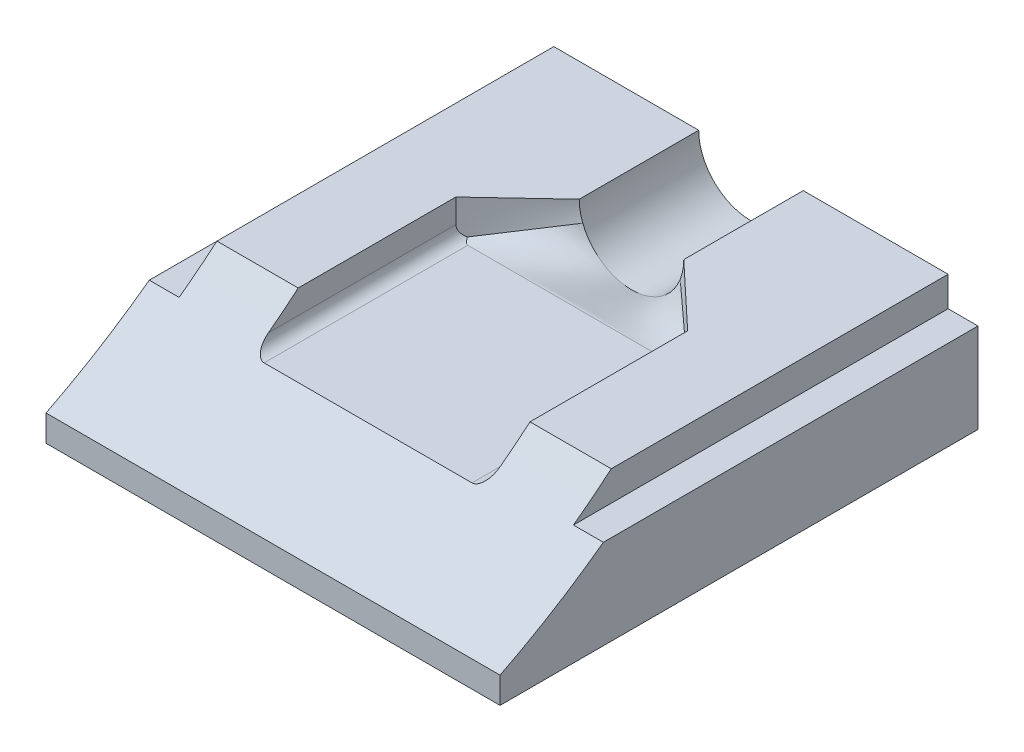
ISO-10303-21;
HEADER;
FILE_DESCRIPTION(('STEP AP214'),'2;1');
FILE_NAME('part.step','',(''),(''),'','','');
FILE_SCHEMA(('AUTOMOTIVE_DESIGN { 1 0 10303 214 1 1 1 1 }'));
ENDSEC;
DATA;
#1=APPLICATION_CONTEXT('core data for automotive mechanical design processes');
#2=APPLICATION_PROTOCOL_DEFINITION('international standard','automotive_design',2000,#1);
#3=PRODUCT_CONTEXT('',#1,'mechanical');
#4=PRODUCT('Part','Part','',(#3));
#5=PRODUCT_RELATED_PRODUCT_CATEGORY('part','',(#4));
#6=PRODUCT_DEFINITION_FORMATION('','',#4);
#7=PRODUCT_DEFINITION_CONTEXT('part definition',#1,'design');
#8=PRODUCT_DEFINITION('design','',#6,#7);
#9=PRODUCT_DEFINITION_SHAPE('','',#8);
#10=(LENGTH_UNIT() NAMED_UNIT(*) SI_UNIT(.MILLI.,.METRE.));
#11=(NAMED_UNIT(*) PLANE_ANGLE_UNIT() SI_UNIT($,.RADIAN.));
#12=(NAMED_UNIT(*) SI_UNIT($,.STERADIAN.) SOLID_ANGLE_UNIT());
#13=UNCERTAINTY_MEASURE_WITH_UNIT(LENGTH_MEASURE(1.E-05),#10,'distance_accuracy_value','');
#14=(GEOMETRIC_REPRESENTATION_CONTEXT(3) GLOBAL_UNCERTAINTY_ASSIGNED_CONTEXT((#13)) GLOBAL_UNIT_ASSIGNED_CONTEXT((#10,
#11,#12)) REPRESENTATION_CONTEXT('',''));
#15=CARTESIAN_POINT('',(0.,0.,0.));
#16=DIRECTION('',(0.,0.,1.));
#17=DIRECTION('',(1.,0.,0.));
#18=AXIS2_PLACEMENT_3D('',#15,#16,#17);
#19=CARTESIAN_POINT('',(-24.13,6.35,50.8));
#20=DIRECTION('',(0.,-1.,0.));
#21=DIRECTION('',(0.,0.,-1.));
#22=AXIS2_PLACEMENT_3D('',#19,#20,#21);
#23=PLANE('',#22);
#24=DIRECTION('',(0.,0.,1.));
#25=VECTOR('',#24,1.);
#26=CARTESIAN_POINT('',(12.319,6.35,19.05));
#27=LINE('',#26,#25);
#28=CARTESIAN_POINT('',(12.319,6.35,19.05));
#29=VERTEX_POINT('',#28);
#30=CARTESIAN_POINT('',(12.319,6.35,35.8059844851894));
#31=VERTEX_POINT('',#30);
#32=EDGE_CURVE('E320',#29,#31,#27,.T.);
#33=ORIENTED_EDGE('',*,*,#32,.T.);
#34=DIRECTION('',(-1.,0.,0.));
#35=VECTOR('',#34,1.);
#36=CARTESIAN_POINT('',(24.13,6.35,35.8059844851894));
#37=LINE('',#36,#35);
#38=CARTESIAN_POINT('',(20.955,6.35,35.8059844851894));
#39=VERTEX_POINT('',#38);
#40=EDGE_CURVE('E376',#31,#39,#37,.F.);
#41=ORIENTED_EDGE('',*,*,#40,.T.);
#42=DIRECTION('',(0.,0.,-1.));
#43=VECTOR('',#42,1.);
#44=CARTESIAN_POINT('',(20.955,6.35,50.8));
#45=LINE('',#44,#43);
#46=CARTESIAN_POINT('',(20.955,6.35,0.));
#47=VERTEX_POINT('',#46);
#48=EDGE_CURVE('E232',#39,#47,#45,.T.);
#49=ORIENTED_EDGE('',*,*,#48,.T.);
#50=DIRECTION('',(-1.,0.,0.));
#51=VECTOR('',#50,1.);
#52=CARTESIAN_POINT('',(-24.13,6.35,0.));
#53=LINE('',#52,#51);
#54=CARTESIAN_POINT('',(5.55625,6.35,0.));
#55=VERTEX_POINT('',#54);
#56=EDGE_CURVE('E251',#47,#55,#53,.T.);
#57=ORIENTED_EDGE('',*,*,#56,.T.);
#58=DIRECTION('',(0.,0.,-1.));
#59=VECTOR('',#58,1.);
#60=CARTESIAN_POINT('',(5.55625,6.35,12.7));
#61=LINE('',#60,#59);
#62=CARTESIAN_POINT('',(5.55625,6.35,12.7));
#63=VERTEX_POINT('',#62);
#64=EDGE_CURVE('E589',#63,#55,#61,.T.);
#65=ORIENTED_EDGE('',*,*,#64,.F.);
#66=CARTESIAN_POINT('',(12.319,6.35,19.05));
#67=CARTESIAN_POINT('',(10.06475,6.35,16.9333333333333));
#68=CARTESIAN_POINT('',(7.8105,6.35,14.8166666666667));
#69=CARTESIAN_POINT('',(5.55625,6.35,12.7));
#70=B_SPLINE_CURVE_WITH_KNOTS('',3,(#66,#67,#68,#69),.UNSPECIFIED.,.F.,.F.,(4,4),(0.,1.),.UNSPECIFIED.);
#71=EDGE_CURVE('E379',#63,#29,#70,.F.);
#72=ORIENTED_EDGE('',*,*,#71,.T.);
#73=EDGE_LOOP('',(#33,#41,#49,#57,#65,#72));
#74=FACE_BOUND('',#73,.T.);
#75=ADVANCED_FACE('F65',(#74),#23,.F.);
#76=DIRECTION('',(0.,0.,-1.));
#77=VECTOR('',#76,1.);
#78=CARTESIAN_POINT('',(-20.955,6.35,50.8));
#79=LINE('',#78,#77);
#80=CARTESIAN_POINT('',(-20.955,6.35,35.8059844851894));
#81=VERTEX_POINT('',#80);
#82=CARTESIAN_POINT('',(-20.955,6.35,0.));
#83=VERTEX_POINT('',#82);
#84=EDGE_CURVE('E611',#81,#83,#79,.T.);
#85=ORIENTED_EDGE('',*,*,#84,.F.);
#86=DIRECTION('',(-1.,0.,0.));
#87=VECTOR('',#86,1.);
#88=CARTESIAN_POINT('',(24.13,6.35,35.8059844851894));
#89=LINE('',#88,#87);
#90=CARTESIAN_POINT('',(-12.319,6.35,35.8059844851894));
#91=VERTEX_POINT('',#90);
#92=EDGE_CURVE('E391',#81,#91,#89,.F.);
#93=ORIENTED_EDGE('',*,*,#92,.T.);
#94=DIRECTION('',(0.,0.,1.));
#95=VECTOR('',#94,1.);
#96=CARTESIAN_POINT('',(-12.319,6.35,19.05));
#97=LINE('',#96,#95);
#98=CARTESIAN_POINT('',(-12.319,6.35,19.05));
#99=VERTEX_POINT('',#98);
#100=EDGE_CURVE('E328',#99,#91,#97,.T.);
#101=ORIENTED_EDGE('',*,*,#100,.F.);
#102=CARTESIAN_POINT('',(-5.55625,6.35,12.7));
#103=CARTESIAN_POINT('',(-7.8105,6.35,14.8166666666667));
#104=CARTESIAN_POINT('',(-10.06475,6.35,16.9333333333333));
#105=CARTESIAN_POINT('',(-12.319,6.35,19.05));
#106=B_SPLINE_CURVE_WITH_KNOTS('',3,(#102,#103,#104,#105),.UNSPECIFIED.,.F.,.F.,(4,4),(0.,1.),.UNSPECIFIED.);
#107=CARTESIAN_POINT('',(-5.55625,6.35,12.7));
#108=VERTEX_POINT('',#107);
#109=EDGE_CURVE('E583',#108,#99,#106,.T.);
#110=ORIENTED_EDGE('',*,*,#109,.F.);
#111=DIRECTION('',(0.,0.,-1.));
#112=VECTOR('',#111,1.);
#113=CARTESIAN_POINT('',(-5.55625,6.35,12.7));
#114=LINE('',#113,#112);
#115=CARTESIAN_POINT('',(-5.55625,6.35,0.));
#116=VERTEX_POINT('',#115);
#117=EDGE_CURVE('E250',#116,#108,#114,.F.);
#118=ORIENTED_EDGE('',*,*,#117,.F.);
#119=EDGE_CURVE('E249',#116,#83,#53,.T.);
#120=ORIENTED_EDGE('',*,*,#119,.T.);
#121=EDGE_LOOP('',(#85,#93,#101,#110,#118,#120));
#122=FACE_BOUND('',#121,.T.);
#123=ADVANCED_FACE('F295',(#122),#23,.F.);
#124=CARTESIAN_POINT('',(0.,0.,0.));
#125=DIRECTION('',(0.,0.,1.));
#126=DIRECTION('',(1.,0.,0.));
#127=AXIS2_PLACEMENT_3D('',#124,#125,#126);
#128=PLANE('',#127);
#129=DIRECTION('',(-1.,0.,0.));
#130=VECTOR('',#129,1.);
#131=CARTESIAN_POINT('',(-20.955,3.175,0.));
#132=LINE('',#131,#130);
#133=CARTESIAN_POINT('',(-20.955,3.175,0.));
#134=VERTEX_POINT('',#133);
#135=CARTESIAN_POINT('',(-24.13,3.175,0.));
#136=VERTEX_POINT('',#135);
#137=EDGE_CURVE('E617',#134,#136,#132,.T.);
#138=ORIENTED_EDGE('',*,*,#137,.F.);
#139=DIRECTION('',(0.,-1.,0.));
#140=VECTOR('',#139,1.);
#141=CARTESIAN_POINT('',(-20.955,6.35,0.));
#142=LINE('',#141,#140);
#143=EDGE_CURVE('E610',#83,#134,#142,.T.);
#144=ORIENTED_EDGE('',*,*,#143,.F.);
#145=ORIENTED_EDGE('',*,*,#119,.F.);
#146=CARTESIAN_POINT('',(0.,6.35,0.));
#147=DIRECTION('',(0.,0.,1.));
#148=DIRECTION('',(1.,0.,0.));
#149=AXIS2_PLACEMENT_3D('',#146,#147,#148);
#150=CIRCLE('',#149,5.55625);
#151=EDGE_CURVE('E260',#55,#116,#150,.F.);
#152=ORIENTED_EDGE('',*,*,#151,.F.);
#153=ORIENTED_EDGE('',*,*,#56,.F.);
#154=DIRECTION('',(0.,-1.,0.));
#155=VECTOR('',#154,1.);
#156=CARTESIAN_POINT('',(20.955,6.35,0.));
#157=LINE('',#156,#155);
#158=CARTESIAN_POINT('',(20.955,3.175,0.));
#159=VERTEX_POINT('',#158);
#160=EDGE_CURVE('E607',#47,#159,#157,.T.);
#161=ORIENTED_EDGE('',*,*,#160,.T.);
#162=DIRECTION('',(1.,0.,0.));
#163=VECTOR('',#162,1.);
#164=CARTESIAN_POINT('',(20.955,3.175,0.));
#165=LINE('',#164,#163);
#166=CARTESIAN_POINT('',(24.13,3.175,0.));
#167=VERTEX_POINT('',#166);
#168=EDGE_CURVE('E236',#159,#167,#165,.T.);
#169=ORIENTED_EDGE('',*,*,#168,.T.);
#170=DIRECTION('',(0.,1.,0.));
#171=VECTOR('',#170,1.);
#172=CARTESIAN_POINT('',(24.13,6.35,0.));
#173=LINE('',#172,#171);
#174=CARTESIAN_POINT('',(24.13,-6.35,0.));
#175=VERTEX_POINT('',#174);
#176=EDGE_CURVE('E231',#175,#167,#173,.T.);
#177=ORIENTED_EDGE('',*,*,#176,.F.);
#178=DIRECTION('',(1.,0.,0.));
#179=VECTOR('',#178,1.);
#180=CARTESIAN_POINT('',(-24.13,-6.35,0.));
#181=LINE('',#180,#179);
#182=CARTESIAN_POINT('',(-24.13,-6.35,0.));
#183=VERTEX_POINT('',#182);
#184=EDGE_CURVE('E243',#183,#175,#181,.T.);
#185=ORIENTED_EDGE('',*,*,#184,.F.);
#186=DIRECTION('',(0.,-1.,0.));
#187=VECTOR('',#186,1.);
#188=CARTESIAN_POINT('',(-24.13,6.35,0.));
#189=LINE('',#188,#187);
#190=EDGE_CURVE('E253',#136,#183,#189,.T.);
#191=ORIENTED_EDGE('',*,*,#190,.F.);
#192=EDGE_LOOP('',(#138,#144,#145,#152,#153,#161,#169,#177,#185,#191));
#193=FACE_BOUND('',#192,.T.);
#194=ADVANCED_FACE('F292',(#193),#128,.F.);
#195=CARTESIAN_POINT('',(24.13,6.35,50.8));
#196=DIRECTION('',(-1.,0.,0.));
#197=DIRECTION('',(0.,0.,1.));
#198=AXIS2_PLACEMENT_3D('',#195,#196,#197);
#199=PLANE('',#198);
#200=DIRECTION('',(0.,0.,-1.));
#201=VECTOR('',#200,1.);
#202=CARTESIAN_POINT('',(24.13,3.175,50.8));
#203=LINE('',#202,#201);
#204=CARTESIAN_POINT('',(24.13,3.175,39.8240109496797));
#205=VERTEX_POINT('',#204);
#206=EDGE_CURVE('E222',#205,#167,#203,.T.);
#207=ORIENTED_EDGE('',*,*,#206,.F.);
#208=CARTESIAN_POINT('',(24.13,64.5160000000001,85.0315514600857));
#209=DIRECTION('',(-1.,0.,0.));
#210=DIRECTION('',(0.,0.,1.));
#211=AXIS2_PLACEMENT_3D('',#208,#209,#210);
#212=CIRCLE('',#211,76.2000000000001);
#213=CARTESIAN_POINT('',(24.13,-3.56219683742737,50.8));
#214=VERTEX_POINT('',#213);
#215=EDGE_CURVE('E204',#205,#214,#212,.T.);
#216=ORIENTED_EDGE('',*,*,#215,.T.);
#217=DIRECTION('',(0.,1.,0.));
#218=VECTOR('',#217,1.);
#219=CARTESIAN_POINT('',(24.13,6.35,50.8));
#220=LINE('',#219,#218);
#221=CARTESIAN_POINT('',(24.13,-6.35,50.8));
#222=VERTEX_POINT('',#221);
#223=EDGE_CURVE('E240',#222,#214,#220,.T.);
#224=ORIENTED_EDGE('',*,*,#223,.F.);
#225=DIRECTION('',(0.,0.,-1.));
#226=VECTOR('',#225,1.);
#227=CARTESIAN_POINT('',(24.13,-6.35,50.8));
#228=LINE('',#227,#226);
#229=EDGE_CURVE('E247',#222,#175,#228,.T.);
#230=ORIENTED_EDGE('',*,*,#229,.T.);
#231=ORIENTED_EDGE('',*,*,#176,.T.);
#232=EDGE_LOOP('',(#207,#216,#224,#230,#231));
#233=FACE_BOUND('',#232,.T.);
#234=ADVANCED_FACE('F228',(#233),#199,.F.);
#235=CARTESIAN_POINT('',(0.,0.,50.8));
#236=DIRECTION('',(0.,0.,1.));
#237=DIRECTION('',(1.,0.,0.));
#238=AXIS2_PLACEMENT_3D('',#235,#236,#237);
#239=PLANE('',#238);
#240=DIRECTION('',(-1.,0.,0.));
#241=VECTOR('',#240,1.);
#242=CARTESIAN_POINT('',(24.13,-3.56219683742735,50.8));
#243=LINE('',#242,#241);
#244=CARTESIAN_POINT('',(-24.13,-3.56219683742737,50.8));
#245=VERTEX_POINT('',#244);
#246=EDGE_CURVE('E210',#245,#214,#243,.F.);
#247=ORIENTED_EDGE('',*,*,#246,.F.);
#248=DIRECTION('',(0.,-1.,0.));
#249=VECTOR('',#248,1.);
#250=CARTESIAN_POINT('',(-24.13,6.35,50.8));
#251=LINE('',#250,#249);
#252=CARTESIAN_POINT('',(-24.13,-6.35,50.8));
#253=VERTEX_POINT('',#252);
#254=EDGE_CURVE('E242',#245,#253,#251,.T.);
#255=ORIENTED_EDGE('',*,*,#254,.T.);
#256=DIRECTION('',(1.,0.,0.));
#257=VECTOR('',#256,1.);
#258=CARTESIAN_POINT('',(-24.13,-6.35,50.8));
#259=LINE('',#258,#257);
#260=EDGE_CURVE('E245',#253,#222,#259,.T.);
#261=ORIENTED_EDGE('',*,*,#260,.T.);
#262=ORIENTED_EDGE('',*,*,#223,.T.);
#263=EDGE_LOOP('',(#247,#255,#261,#262));
#264=FACE_BOUND('',#263,.T.);
#265=ADVANCED_FACE('F287',(#264),#239,.T.);
#266=CARTESIAN_POINT('',(-24.13,6.35,50.8));
#267=DIRECTION('',(1.,0.,0.));
#268=DIRECTION('',(0.,0.,-1.));
#269=AXIS2_PLACEMENT_3D('',#266,#267,#268);
#270=PLANE('',#269);
#271=ORIENTED_EDGE('',*,*,#254,.F.);
#272=CARTESIAN_POINT('',(-24.13,64.5160000000001,85.0315514600857));
#273=DIRECTION('',(-1.,0.,0.));
#274=DIRECTION('',(0.,0.,1.));
#275=AXIS2_PLACEMENT_3D('',#272,#273,#274);
#276=CIRCLE('',#275,76.2000000000001);
#277=CARTESIAN_POINT('',(-24.13,3.175,39.8240109496797));
#278=VERTEX_POINT('',#277);
#279=EDGE_CURVE('E216',#278,#245,#276,.T.);
#280=ORIENTED_EDGE('',*,*,#279,.F.);
#281=DIRECTION('',(0.,0.,-1.));
#282=VECTOR('',#281,1.);
#283=CARTESIAN_POINT('',(-24.13,3.175,50.8));
#284=LINE('',#283,#282);
#285=EDGE_CURVE('E612',#278,#136,#284,.T.);
#286=ORIENTED_EDGE('',*,*,#285,.T.);
#287=ORIENTED_EDGE('',*,*,#190,.T.);
#288=DIRECTION('',(0.,0.,-1.));
#289=VECTOR('',#288,1.);
#290=CARTESIAN_POINT('',(-24.13,-6.35,50.8));
#291=LINE('',#290,#289);
#292=EDGE_CURVE('E257',#253,#183,#291,.T.);
#293=ORIENTED_EDGE('',*,*,#292,.F.);
#294=EDGE_LOOP('',(#271,#280,#286,#287,#293));
#295=FACE_BOUND('',#294,.T.);
#296=ADVANCED_FACE('F290',(#295),#270,.F.);
#297=CARTESIAN_POINT('',(-24.13,-6.35,50.8));
#298=DIRECTION('',(0.,1.,0.));
#299=DIRECTION('',(0.,0.,1.));
#300=AXIS2_PLACEMENT_3D('',#297,#298,#299);
#301=PLANE('',#300);
#302=ORIENTED_EDGE('',*,*,#184,.T.);
#303=ORIENTED_EDGE('',*,*,#229,.F.);
#304=ORIENTED_EDGE('',*,*,#260,.F.);
#305=ORIENTED_EDGE('',*,*,#292,.T.);
#306=EDGE_LOOP('',(#302,#303,#304,#305));
#307=FACE_BOUND('',#306,.T.);
#308=ADVANCED_FACE('F285',(#307),#301,.F.);
#309=CARTESIAN_POINT('',(0.,6.35,12.7));
#310=DIRECTION('',(0.,0.,-1.));
#311=DIRECTION('',(-1.,0.,0.));
#312=AXIS2_PLACEMENT_3D('',#309,#310,#311);
#313=CYLINDRICAL_SURFACE('',#312,5.55625);
#314=ORIENTED_EDGE('',*,*,#117,.T.);
#315=CARTESIAN_POINT('',(-5.17812270854848,4.33531409948982,12.7));
#316=CARTESIAN_POINT('',(-5.24041918850231,4.49542780129807,12.7));
#317=CARTESIAN_POINT('',(-5.35015084943678,4.82144223525844,12.7));
#318=CARTESIAN_POINT('',(-5.46873627413656,5.32359085422752,12.7));
#319=CARTESIAN_POINT('',(-5.54030254184816,5.83458103714852,12.7));
#320=CARTESIAN_POINT('',(-5.55625,6.17819415341328,12.7));
#321=CARTESIAN_POINT('',(-5.55625,6.35,12.7));
#322=B_SPLINE_CURVE_WITH_KNOTS('',3,(#315,#316,#317,#318,#319,#320,#321),.UNSPECIFIED.,.F.,.F.,
(4,1,1,1,4),(0.,0.0295275590551181,0.0590551181102362,0.0885826771653544,0.118110236220472),.UNSPECIFIED.);
#323=CARTESIAN_POINT('',(-5.17814942518163,4.33530365676074,12.7));
#324=VERTEX_POINT('',#323);
#325=EDGE_CURVE('E234',#108,#324,#322,.F.);
#326=ORIENTED_EDGE('',*,*,#325,.T.);
#327=CARTESIAN_POINT('',(0.,6.35,12.7));
#328=DIRECTION('',(0.,0.,1.));
#329=DIRECTION('',(1.,0.,0.));
#330=AXIS2_PLACEMENT_3D('',#327,#328,#329);
#331=CIRCLE('',#330,5.55625);
#332=CARTESIAN_POINT('',(5.17813583325495,4.33530897595926,12.7));
#333=VERTEX_POINT('',#332);
#334=EDGE_CURVE('E409',#324,#333,#331,.T.);
#335=ORIENTED_EDGE('',*,*,#334,.T.);
#336=EDGE_CURVE('E412',#333,#63,#331,.T.);
#337=ORIENTED_EDGE('',*,*,#336,.T.);
#338=ORIENTED_EDGE('',*,*,#64,.T.);
#339=ORIENTED_EDGE('',*,*,#151,.T.);
#340=EDGE_LOOP('',(#314,#326,#335,#337,#338,#339));
#341=FACE_BOUND('',#340,.T.);
#342=ADVANCED_FACE('F274',(#341),#313,.F.);
#343=CARTESIAN_POINT('',(20.955,6.35,50.8));
#344=DIRECTION('',(1.,0.,0.));
#345=DIRECTION('',(0.,0.,-1.));
#346=AXIS2_PLACEMENT_3D('',#343,#344,#345);
#347=PLANE('',#346);
#348=CARTESIAN_POINT('',(20.955,64.5160000000001,85.0315514600857));
#349=DIRECTION('',(1.,0.,0.));
#350=DIRECTION('',(0.,0.,-1.));
#351=AXIS2_PLACEMENT_3D('',#348,#349,#350);
#352=CIRCLE('',#351,76.2000000000001);
#353=CARTESIAN_POINT('',(20.955,3.175,39.8240109496797));
#354=VERTEX_POINT('',#353);
#355=EDGE_CURVE('E389',#354,#39,#352,.T.);
#356=ORIENTED_EDGE('',*,*,#355,.F.);
#357=DIRECTION('',(0.,0.,-1.));
#358=VECTOR('',#357,1.);
#359=CARTESIAN_POINT('',(20.955,3.175,50.8));
#360=LINE('',#359,#358);
#361=EDGE_CURVE('E224',#354,#159,#360,.T.);
#362=ORIENTED_EDGE('',*,*,#361,.T.);
#363=ORIENTED_EDGE('',*,*,#160,.F.);
#364=ORIENTED_EDGE('',*,*,#48,.F.);
#365=EDGE_LOOP('',(#356,#362,#363,#364));
#366=FACE_BOUND('',#365,.T.);
#367=ADVANCED_FACE('F284',(#366),#347,.T.);
#368=CARTESIAN_POINT('',(20.955,3.175,50.8));
#369=DIRECTION('',(0.,1.,0.));
#370=DIRECTION('',(0.,0.,1.));
#371=AXIS2_PLACEMENT_3D('',#368,#369,#370);
#372=PLANE('',#371);
#373=DIRECTION('',(-1.,0.,0.));
#374=VECTOR('',#373,1.);
#375=CARTESIAN_POINT('',(24.13,3.175,39.8240109496797));
#376=LINE('',#375,#374);
#377=EDGE_CURVE('E207',#205,#354,#376,.T.);
#378=ORIENTED_EDGE('',*,*,#377,.F.);
#379=ORIENTED_EDGE('',*,*,#206,.T.);
#380=ORIENTED_EDGE('',*,*,#168,.F.);
#381=ORIENTED_EDGE('',*,*,#361,.F.);
#382=EDGE_LOOP('',(#378,#379,#380,#381));
#383=FACE_BOUND('',#382,.T.);
#384=ADVANCED_FACE('F220',(#383),#372,.T.);
#385=CARTESIAN_POINT('',(-20.955,6.35,50.8));
#386=DIRECTION('',(1.,0.,0.));
#387=DIRECTION('',(0.,0.,-1.));
#388=AXIS2_PLACEMENT_3D('',#385,#386,#387);
#389=PLANE('',#388);
#390=DIRECTION('',(0.,0.,-1.));
#391=VECTOR('',#390,1.);
#392=CARTESIAN_POINT('',(-20.955,3.175,50.8));
#393=LINE('',#392,#391);
#394=CARTESIAN_POINT('',(-20.955,3.175,39.8240109496797));
#395=VERTEX_POINT('',#394);
#396=EDGE_CURVE('E614',#395,#134,#393,.T.);
#397=ORIENTED_EDGE('',*,*,#396,.F.);
#398=CARTESIAN_POINT('',(-20.955,64.5160000000001,85.0315514600857));
#399=DIRECTION('',(1.,0.,0.));
#400=DIRECTION('',(0.,0.,-1.));
#401=AXIS2_PLACEMENT_3D('',#398,#399,#400);
#402=CIRCLE('',#401,76.2000000000001);
#403=EDGE_CURVE('E390',#395,#81,#402,.T.);
#404=ORIENTED_EDGE('',*,*,#403,.T.);
#405=ORIENTED_EDGE('',*,*,#84,.T.);
#406=ORIENTED_EDGE('',*,*,#143,.T.);
#407=EDGE_LOOP('',(#397,#404,#405,#406));
#408=FACE_BOUND('',#407,.T.);
#409=ADVANCED_FACE('F358',(#408),#389,.F.);
#410=CARTESIAN_POINT('',(-20.955,3.175,50.8));
#411=DIRECTION('',(0.,-1.,0.));
#412=DIRECTION('',(0.,0.,-1.));
#413=AXIS2_PLACEMENT_3D('',#410,#411,#412);
#414=PLANE('',#413);
#415=ORIENTED_EDGE('',*,*,#285,.F.);
#416=DIRECTION('',(-1.,0.,0.));
#417=VECTOR('',#416,1.);
#418=CARTESIAN_POINT('',(24.13,3.175,39.8240109496797));
#419=LINE('',#418,#417);
#420=EDGE_CURVE('E225',#278,#395,#419,.F.);
#421=ORIENTED_EDGE('',*,*,#420,.T.);
#422=ORIENTED_EDGE('',*,*,#396,.T.);
#423=ORIENTED_EDGE('',*,*,#137,.T.);
#424=EDGE_LOOP('',(#415,#421,#422,#423));
#425=FACE_BOUND('',#424,.T.);
#426=ADVANCED_FACE('F354',(#425),#414,.F.);
#427=CARTESIAN_POINT('',(-12.319,6.35,19.05));
#428=DIRECTION('',(-1.,0.,0.));
#429=DIRECTION('',(0.,0.,1.));
#430=AXIS2_PLACEMENT_3D('',#427,#428,#429);
#431=PLANE('',#430);
#432=CARTESIAN_POINT('',(-12.319,64.5160000000001,85.0315514600857));
#433=DIRECTION('',(-1.,0.,0.));
#434=DIRECTION('',(0.,0.,1.));
#435=AXIS2_PLACEMENT_3D('',#432,#433,#434);
#436=CIRCLE('',#435,76.2000000000001);
#437=CARTESIAN_POINT('',(-12.319,3.81,38.9748303001941));
#438=VERTEX_POINT('',#437);
#439=EDGE_CURVE('E387',#91,#438,#436,.T.);
#440=ORIENTED_EDGE('',*,*,#439,.T.);
#441=DIRECTION('',(0.,0.,1.));
#442=VECTOR('',#441,1.);
#443=CARTESIAN_POINT('',(-12.319,3.81,19.05));
#444=LINE('',#443,#442);
#445=CARTESIAN_POINT('',(-12.319,3.81,19.05));
#446=VERTEX_POINT('',#445);
#447=EDGE_CURVE('E85',#438,#446,#444,.F.);
#448=ORIENTED_EDGE('',*,*,#447,.T.);
#449=CARTESIAN_POINT('',(-12.319,6.35,19.05));
#450=CARTESIAN_POINT('',(-12.319,6.0325,19.05));
#451=CARTESIAN_POINT('',(-12.319,5.3975,19.05));
#452=CARTESIAN_POINT('',(-12.319,4.445,19.05));
#453=CARTESIAN_POINT('',(-12.319,3.4925,19.05));
#454=CARTESIAN_POINT('',(-12.319,2.8575,19.05));
#455=CARTESIAN_POINT('',(-12.319,2.54,19.05));
#456=B_SPLINE_CURVE_WITH_KNOTS('',3,(#449,#450,#451,#452,#453,#454,#455),.UNSPECIFIED.,.F.,.F.,
(4,1,1,1,4),(0.,0.0295275590551181,0.0590551181102362,0.0885826771653544,0.118110236220472),.UNSPECIFIED.);
#457=EDGE_CURVE('E334',#99,#446,#456,.T.);
#458=ORIENTED_EDGE('',*,*,#457,.F.);
#459=ORIENTED_EDGE('',*,*,#100,.T.);
#460=EDGE_LOOP('',(#440,#448,#458,#459));
#461=FACE_BOUND('',#460,.T.);
#462=ADVANCED_FACE('F344',(#461),#431,.F.);
#463=CARTESIAN_POINT('',(12.319,2.54,19.05));
#464=DIRECTION('',(1.,0.,0.));
#465=DIRECTION('',(0.,0.,-1.));
#466=AXIS2_PLACEMENT_3D('',#463,#464,#465);
#467=PLANE('',#466);
#468=CARTESIAN_POINT('',(12.319,2.54,19.05));
#469=CARTESIAN_POINT('',(12.319,2.8575,19.05));
#470=CARTESIAN_POINT('',(12.319,3.4925,19.05));
#471=CARTESIAN_POINT('',(12.319,4.445,19.05));
#472=CARTESIAN_POINT('',(12.319,5.3975,19.05));
#473=CARTESIAN_POINT('',(12.319,6.0325,19.05));
#474=CARTESIAN_POINT('',(12.319,6.35,19.05));
#475=B_SPLINE_CURVE_WITH_KNOTS('',3,(#468,#469,#470,#471,#472,#473,#474),.UNSPECIFIED.,.F.,.F.,
(4,1,1,1,4),(0.881889763779527,0.911417322834645,0.940944881889764,0.970472440944882,1.),.UNSPECIFIED.);
#476=CARTESIAN_POINT('',(12.319,3.81,19.05));
#477=VERTEX_POINT('',#476);
#478=EDGE_CURVE('E329',#477,#29,#475,.T.);
#479=ORIENTED_EDGE('',*,*,#478,.F.);
#480=DIRECTION('',(0.,0.,1.));
#481=VECTOR('',#480,1.);
#482=CARTESIAN_POINT('',(12.319,3.81,40.6985454262061));
#483=LINE('',#482,#481);
#484=CARTESIAN_POINT('',(12.319,3.81,38.9748303001941));
#485=VERTEX_POINT('',#484);
#486=EDGE_CURVE('E386',#477,#485,#483,.T.);
#487=ORIENTED_EDGE('',*,*,#486,.T.);
#488=CARTESIAN_POINT('',(12.319,64.5160000000001,85.0315514600857));
#489=DIRECTION('',(1.,0.,0.));
#490=DIRECTION('',(0.,0.,-1.));
#491=AXIS2_PLACEMENT_3D('',#488,#489,#490);
#492=CIRCLE('',#491,76.2000000000001);
#493=EDGE_CURVE('E215',#485,#31,#492,.T.);
#494=ORIENTED_EDGE('',*,*,#493,.T.);
#495=ORIENTED_EDGE('',*,*,#32,.F.);
#496=EDGE_LOOP('',(#479,#487,#494,#495));
#497=FACE_BOUND('',#496,.T.);
#498=ADVANCED_FACE('F353',(#497),#467,.F.);
#499=CARTESIAN_POINT('',(-12.319,2.54,19.05));
#500=DIRECTION('',(0.,-1.,0.));
#501=DIRECTION('',(0.,0.,-1.));
#502=AXIS2_PLACEMENT_3D('',#499,#500,#501);
#503=PLANE('',#502);
#504=DIRECTION('',(-1.,0.,0.));
#505=VECTOR('',#504,1.);
#506=CARTESIAN_POINT('',(24.13,2.54,40.6985454262061));
#507=LINE('',#506,#505);
#508=CARTESIAN_POINT('',(-11.049,2.54,40.6985454262061));
#509=VERTEX_POINT('',#508);
#510=CARTESIAN_POINT('',(11.049,2.54,40.6985454262061));
#511=VERTEX_POINT('',#510);
#512=EDGE_CURVE('E262',#509,#511,#507,.F.);
#513=ORIENTED_EDGE('',*,*,#512,.T.);
#514=DIRECTION('',(0.,0.,1.));
#515=VECTOR('',#514,1.);
#516=CARTESIAN_POINT('',(11.049,2.54,19.05));
#517=LINE('',#516,#515);
#518=CARTESIAN_POINT('',(11.049,2.54,19.05));
#519=VERTEX_POINT('',#518);
#520=EDGE_CURVE('E506',#511,#519,#517,.F.);
#521=ORIENTED_EDGE('',*,*,#520,.T.);
#522=CARTESIAN_POINT('',(-12.319,2.54,19.05));
#523=CARTESIAN_POINT('',(-11.2924166666667,2.54,19.05));
#524=CARTESIAN_POINT('',(-9.23924999999999,2.54,19.05));
#525=CARTESIAN_POINT('',(-6.1595,2.54,19.05));
#526=CARTESIAN_POINT('',(-3.07975,2.54,19.05));
#527=CARTESIAN_POINT('',(0.,2.54,19.05));
#528=CARTESIAN_POINT('',(3.07974999999999,2.54,19.05));
#529=CARTESIAN_POINT('',(6.15949999999999,2.54,19.05));
#530=CARTESIAN_POINT('',(9.23924999999998,2.54,19.05));
#531=CARTESIAN_POINT('',(11.2924166666666,2.54,19.05));
#532=CARTESIAN_POINT('',(12.319,2.54,19.05));
#533=B_SPLINE_CURVE_WITH_KNOTS('',3,(#522,#523,#524,#525,#526,#527,#528,#529,#530,#531,#532),
.UNSPECIFIED.,.F.,.F.,(4,1,1,1,1,1,1,1,4),(0.118110236220472,0.213582677165354,
0.309055118110236,0.404527559055118,0.5,0.595472440944882,0.690944881889764,0.786417322834646,
0.881889763779527),.UNSPECIFIED.);
#534=CARTESIAN_POINT('',(8.37061077567247,2.54,19.05));
#535=VERTEX_POINT('',#534);
#536=EDGE_CURVE('E584',#535,#519,#533,.T.);
#537=ORIENTED_EDGE('',*,*,#536,.F.);
#538=CARTESIAN_POINT('',(-12.319,2.54,19.05));
#539=CARTESIAN_POINT('',(-11.2924166666667,2.54,19.05));
#540=CARTESIAN_POINT('',(-9.23924999999999,2.54,19.05));
#541=CARTESIAN_POINT('',(-6.1595,2.54,19.05));
#542=CARTESIAN_POINT('',(-3.07975,2.54,19.05));
#543=CARTESIAN_POINT('',(0.,2.54,19.05));
#544=CARTESIAN_POINT('',(3.07974999999999,2.54,19.05));
#545=CARTESIAN_POINT('',(6.15949999999999,2.54,19.05));
#546=CARTESIAN_POINT('',(9.23924999999998,2.54,19.05));
#547=CARTESIAN_POINT('',(11.2924166666666,2.54,19.05));
#548=CARTESIAN_POINT('',(12.319,2.54,19.05));
#549=B_SPLINE_CURVE_WITH_KNOTS('',3,(#538,#539,#540,#541,#542,#543,#544,#545,#546,#547,#548),
.UNSPECIFIED.,.F.,.F.,(4,1,1,1,1,1,1,1,4),(0.118110236220472,0.213582677165354,
0.309055118110236,0.404527559055118,0.5,0.595472440944882,0.690944881889764,0.786417322834646,
0.881889763779527),.UNSPECIFIED.);
#550=CARTESIAN_POINT('',(-8.37061077567244,2.54,19.05));
#551=VERTEX_POINT('',#550);
#552=EDGE_CURVE('E475',#551,#535,#549,.T.);
#553=ORIENTED_EDGE('',*,*,#552,.F.);
#554=CARTESIAN_POINT('',(-12.319,2.54,19.05));
#555=CARTESIAN_POINT('',(-11.2924166666667,2.54,19.05));
#556=CARTESIAN_POINT('',(-9.23924999999999,2.54,19.05));
#557=CARTESIAN_POINT('',(-6.1595,2.54,19.05));
#558=CARTESIAN_POINT('',(-3.07975,2.54,19.05));
#559=CARTESIAN_POINT('',(0.,2.54,19.05));
#560=CARTESIAN_POINT('',(3.07974999999999,2.54,19.05));
#561=CARTESIAN_POINT('',(6.15949999999999,2.54,19.05));
#562=CARTESIAN_POINT('',(9.23924999999998,2.54,19.05));
#563=CARTESIAN_POINT('',(11.2924166666666,2.54,19.05));
#564=CARTESIAN_POINT('',(12.319,2.54,19.05));
#565=B_SPLINE_CURVE_WITH_KNOTS('',3,(#554,#555,#556,#557,#558,#559,#560,#561,#562,#563,#564),
.UNSPECIFIED.,.F.,.F.,(4,1,1,1,1,1,1,1,4),(0.118110236220472,0.213582677165354,
0.309055118110236,0.404527559055118,0.5,0.595472440944882,0.690944881889764,0.786417322834646,
0.881889763779527),.UNSPECIFIED.);
#566=CARTESIAN_POINT('',(-11.049,2.54,19.05));
#567=VERTEX_POINT('',#566);
#568=EDGE_CURVE('E497',#567,#551,#565,.T.);
#569=ORIENTED_EDGE('',*,*,#568,.F.);
#570=DIRECTION('',(0.,0.,1.));
#571=VECTOR('',#570,1.);
#572=CARTESIAN_POINT('',(-11.049,2.54,40.6985454262061));
#573=LINE('',#572,#571);
#574=EDGE_CURVE('E504',#567,#509,#573,.T.);
#575=ORIENTED_EDGE('',*,*,#574,.T.);
#576=EDGE_LOOP('',(#513,#521,#537,#553,#569,#575));
#577=FACE_BOUND('',#576,.T.);
#578=ADVANCED_FACE('F355',(#577),#503,.F.);
#579=CARTESIAN_POINT('',(5.17812270854848,4.33531409948982,12.7));
#580=CARTESIAN_POINT('',(7.55841513903232,3.73687606632654,14.8166666666667));
#581=CARTESIAN_POINT('',(9.93870756951616,3.13843803316327,16.9333333333333));
#582=CARTESIAN_POINT('',(12.319,2.54,19.05));
#583=CARTESIAN_POINT('',(5.24041918850232,4.49542780129806,12.7));
#584=CARTESIAN_POINT('',(7.59994612566821,3.94945186753204,14.8166666666667));
#585=CARTESIAN_POINT('',(9.9594730628341,3.40347593376602,16.9333333333333));
#586=CARTESIAN_POINT('',(12.319,2.8575,19.05));
#587=CARTESIAN_POINT('',(5.35015050105474,4.82143904977918,12.7));
#588=CARTESIAN_POINT('',(7.6731003340365,4.37845936651945,14.8166666666667));
#589=CARTESIAN_POINT('',(9.99605016701826,3.93547968325973,16.9333333333333));
#590=CARTESIAN_POINT('',(12.319,3.4925,19.05));
#591=CARTESIAN_POINT('',(5.46873872167592,5.32360389487061,12.7));
#592=CARTESIAN_POINT('',(7.75215914778394,5.03073592991374,14.8166666666666));
#593=CARTESIAN_POINT('',(10.035579573892,4.73786796495687,16.9333333333333));
#594=CARTESIAN_POINT('',(12.319,4.445,19.05));
#595=CARTESIAN_POINT('',(5.54030171147245,5.83457794213247,12.7));
#596=CARTESIAN_POINT('',(7.79986780764831,5.68888529475498,14.8166666666667));
#597=CARTESIAN_POINT('',(10.0594339038242,5.54319264737749,16.9333333333333));
#598=CARTESIAN_POINT('',(12.319,5.3975,19.05));
#599=CARTESIAN_POINT('',(5.55625,6.17819415341328,12.7));
#600=CARTESIAN_POINT('',(7.8105,6.12962943560886,14.8166666666667));
#601=CARTESIAN_POINT('',(10.06475,6.08106471780443,16.9333333333333));
#602=CARTESIAN_POINT('',(12.319,6.0325,19.05));
#603=CARTESIAN_POINT('',(5.55625,6.35,12.7));
#604=CARTESIAN_POINT('',(7.8105,6.35,14.8166666666667));
#605=CARTESIAN_POINT('',(10.06475,6.35,16.9333333333333));
#606=CARTESIAN_POINT('',(12.319,6.35,19.05));
#607=B_SPLINE_SURFACE_WITH_KNOTS('',3,3,((#579,#580,#581,#582),(#583,#584,#585,#586),(#587,#588,
#589,#590),(#591,#592,#593,#594),(#595,#596,#597,#598),(#599,#600,#601,#602),(#603,#604,#605,
#606)),.UNSPECIFIED.,.F.,.F.,.F.,(4,1,1,1,4),(4,4),(0.881889763779527,0.911417322834645,
0.940944881889764,0.970472440944882,1.),(0.,1.),.UNSPECIFIED.);
#608=DIRECTION('',(0.734427394043755,-0.184645079555807,0.65308697542818));
#609=VECTOR('',#608,1.);
#610=CARTESIAN_POINT('',(8.74856135427424,3.43765704974491,15.875));
#611=LINE('',#610,#609);
#612=CARTESIAN_POINT('',(11.6712116346291,2.70286284420936,18.4739564759039));
#613=VERTEX_POINT('',#612);
#614=EDGE_CURVE('E485',#333,#613,#611,.T.);
#615=CARTESIAN_POINT('',(11.6712116346291,2.70286284420936,18.4739564759039));
#616=CARTESIAN_POINT('',(11.7456082738449,2.74466014926734,18.539078025734));
#617=CARTESIAN_POINT('',(11.8178324470112,2.79516991593387,18.6025823117069));
#618=CARTESIAN_POINT('',(11.9539492235374,2.9143180984767,18.7227516657826));
#619=CARTESIAN_POINT('',(12.0177540530392,2.98312789527943,18.77934428396));
#620=CARTESIAN_POINT('',(12.1086074658132,3.10753957896646,18.8603246559048));
#621=CARTESIAN_POINT('',(12.140130305858,3.15735826576366,18.8885217310118));
#622=CARTESIAN_POINT('',(12.1967353739927,3.26302491301347,18.9393056664718));
#623=CARTESIAN_POINT('',(12.2218346255837,3.31885636816685,18.9619073501646));
#624=CARTESIAN_POINT('',(12.2644287760335,3.43639024369924,19.0003724663319));
#625=CARTESIAN_POINT('',(12.281831622045,3.49815351426631,19.0161542812938));
#626=CARTESIAN_POINT('',(12.3071167016924,3.62508031955838,19.0391382642478));
#627=CARTESIAN_POINT('',(12.3150285355674,3.69023261794881,19.0463671059849));
#628=CARTESIAN_POINT('',(12.318224368945,3.76468602362863,19.0492900370008));
#629=CARTESIAN_POINT('',(12.3185152427557,3.77374904485316,19.0495562136879));
#630=CARTESIAN_POINT('',(12.318902627256,3.79187372452493,19.0499108009558));
#631=CARTESIAN_POINT('',(12.3189993305709,3.8009353753966,19.049999387713));
#632=CARTESIAN_POINT('',(12.319,3.81,19.05));
#633=B_SPLINE_CURVE_WITH_KNOTS('',3,(#615,#616,#617,#618,#619,#620,#621,#622,#623,#624,#625,
#626,#627,#628,#629,#630,#631,#632),.UNSPECIFIED.,.F.,.F.,(4,2,2,2,2,2,2,2,4),(0.,
0.323154089761577,0.649448154336371,0.84478264220475,1.03959397403922,1.23667618063805,
1.43314212266324,1.46035611163839,1.48754308982515),.UNSPECIFIED.);
#634=EDGE_CURVE('E521',#613,#477,#633,.T.);
#635=ORIENTED_EDGE('',*,*,#614,.T.);
#636=ORIENTED_EDGE('',*,*,#634,.T.);
#637=ORIENTED_EDGE('',*,*,#478,.T.);
#638=ORIENTED_EDGE('',*,*,#71,.F.);
#639=ORIENTED_EDGE('',*,*,#336,.F.);
#640=EDGE_LOOP('',(#635,#636,#637,#638,#639));
#641=FACE_BOUND('',#640,.T.);
#642=ADVANCED_FACE('F429',(#641),#607,.F.);
#643=CARTESIAN_POINT('',(-5.17812270854848,4.33531409948982,12.7));
#644=CARTESIAN_POINT('',(-7.55841513903232,3.73687606632655,14.8166666666667));
#645=CARTESIAN_POINT('',(-9.93870756951616,3.13843803316327,16.9333333333333));
#646=CARTESIAN_POINT('',(-12.319,2.54,19.05));
#647=CARTESIAN_POINT('',(-4.97669742306943,3.81761312955162,12.7));
#648=CARTESIAN_POINT('',(-7.08193717093517,3.39174208636775,14.8166666666667));
#649=CARTESIAN_POINT('',(-9.18717691880092,2.96587104318387,16.9333333333333));
#650=CARTESIAN_POINT('',(-11.2924166666667,2.54,19.05));
#651=CARTESIAN_POINT('',(-4.41750118888563,2.84308765813251,12.7));
#652=CARTESIAN_POINT('',(-6.02475079259042,2.74205843875501,14.8166666666667));
#653=CARTESIAN_POINT('',(-7.63200039629521,2.6410292193775,16.9333333333333));
#654=CARTESIAN_POINT('',(-9.23925,2.54,19.05));
#655=CARTESIAN_POINT('',(-3.18410518588149,1.69449358490918,12.7));
#656=CARTESIAN_POINT('',(-4.17590345725433,1.97632905660612,14.8166666666667));
#657=CARTESIAN_POINT('',(-5.16770172862716,2.25816452830306,16.9333333333333));
#658=CARTESIAN_POINT('',(-6.1595,2.54,19.05));
#659=CARTESIAN_POINT('',(-1.66646447209532,0.961553418947525,12.7));
#660=CARTESIAN_POINT('',(-2.13755964806355,1.48770227929835,14.8166666666667));
#661=CARTESIAN_POINT('',(-2.60865482403178,2.01385113964918,16.9333333333333));
#662=CARTESIAN_POINT('',(-3.07975,2.54,19.05));
#663=CARTESIAN_POINT('',(0.,0.709753618610017,12.7));
#664=CARTESIAN_POINT('',(0.,1.31983574574001,14.8166666666667));
#665=CARTESIAN_POINT('',(0.,1.92991787287001,16.9333333333333));
#666=CARTESIAN_POINT('',(0.,2.54,19.05));
#667=CARTESIAN_POINT('',(1.66646447209533,0.961553418947522,12.7));
#668=CARTESIAN_POINT('',(2.13755964806355,1.48770227929835,14.8166666666667));
#669=CARTESIAN_POINT('',(2.60865482403177,2.01385113964917,16.9333333333333));
#670=CARTESIAN_POINT('',(3.07974999999999,2.54,19.05));
#671=CARTESIAN_POINT('',(3.18410518588148,1.69449358490918,12.7));
#672=CARTESIAN_POINT('',(4.17590345725432,1.97632905660612,14.8166666666667));
#673=CARTESIAN_POINT('',(5.16770172862716,2.25816452830306,16.9333333333333));
#674=CARTESIAN_POINT('',(6.15949999999999,2.54,19.05));
#675=CARTESIAN_POINT('',(4.41750118888564,2.84308765813251,12.7));
#676=CARTESIAN_POINT('',(6.02475079259042,2.74205843875501,14.8166666666667));
#677=CARTESIAN_POINT('',(7.63200039629521,2.6410292193775,16.9333333333333));
#678=CARTESIAN_POINT('',(9.23924999999999,2.54,19.05));
#679=CARTESIAN_POINT('',(4.97669742306944,3.81761312955162,12.7));
#680=CARTESIAN_POINT('',(7.08193717093518,3.39174208636775,14.8166666666667));
#681=CARTESIAN_POINT('',(9.18717691880092,2.96587104318387,16.9333333333333));
#682=CARTESIAN_POINT('',(11.2924166666667,2.54,19.05));
#683=CARTESIAN_POINT('',(5.17812270854848,4.33531409948982,12.7));
#684=CARTESIAN_POINT('',(7.55841513903232,3.73687606632654,14.8166666666667));
#685=CARTESIAN_POINT('',(9.93870756951616,3.13843803316327,16.9333333333333));
#686=CARTESIAN_POINT('',(12.319,2.54,19.05));
#687=B_SPLINE_SURFACE_WITH_KNOTS('',3,3,((#643,#644,#645,#646),(#647,#648,#649,#650),(#651,#652,
#653,#654),(#655,#656,#657,#658),(#659,#660,#661,#662),(#663,#664,#665,#666),(#667,#668,#669,
#670),(#671,#672,#673,#674),(#675,#676,#677,#678),(#679,#680,#681,#682),(#683,#684,#685,#686)),
.UNSPECIFIED.,.F.,.F.,.F.,(4,1,1,1,1,1,1,1,4),(4,4),(0.118110236220472,0.213582677165354,
0.309055118110236,0.404527559055118,0.5,0.595472440944882,0.690944881889764,0.786417322834646,
0.881889763779527),(0.,1.),.UNSPECIFIED.);
#688=CARTESIAN_POINT('',(11.049,2.54,19.05));
#689=CARTESIAN_POINT('',(11.0650571490051,2.53999165841123,19.0500420476711));
#690=CARTESIAN_POINT('',(11.080992991423,2.54030399977764,19.0483508209311));
#691=CARTESIAN_POINT('',(11.1120079063719,2.54147316769582,19.0422195204477));
#692=CARTESIAN_POINT('',(11.1270975208094,2.54231950042971,19.0378324665705));
#693=CARTESIAN_POINT('',(11.1633161372606,2.54496898132654,19.0244354280594));
#694=CARTESIAN_POINT('',(11.1839621537385,2.54703464182926,19.0142225003428));
#695=CARTESIAN_POINT('',(11.2236827321285,2.5519100063932,18.9909486630769));
#696=CARTESIAN_POINT('',(11.2427384668208,2.55472731289233,18.9778589090945));
#697=CARTESIAN_POINT('',(11.2881783767566,2.56242156345056,18.9432781577021));
#698=CARTESIAN_POINT('',(11.3137102050486,2.56763922265642,18.920762698315));
#699=CARTESIAN_POINT('',(11.3626045556387,2.57907308137859,18.8736902830518));
#700=CARTESIAN_POINT('',(11.3859617277319,2.58529164598176,18.8491285599665));
#701=CARTESIAN_POINT('',(11.4311129691691,2.59861895102228,18.7987595354039));
#702=CARTESIAN_POINT('',(11.4529039178169,2.60572939519028,18.7729499096876));
#703=CARTESIAN_POINT('',(11.4952635238854,2.62077622942718,18.7205759350533));
#704=CARTESIAN_POINT('',(11.5158318013016,2.62871287419126,18.6940113552491));
#705=CARTESIAN_POINT('',(11.5597904570855,2.64695946257561,18.6353383233013));
#706=CARTESIAN_POINT('',(11.5829794956755,2.65743445511859,18.6031309902975));
#707=CARTESIAN_POINT('',(11.6279899302603,2.6793880913472,18.5386250065627));
#708=CARTESIAN_POINT('',(11.6498227488363,2.69085556348419,18.5063305429459));
#709=CARTESIAN_POINT('',(11.6712116346305,2.70286284420846,18.4739564759049));
#710=B_SPLINE_CURVE_WITH_KNOTS('',3,(#688,#689,#690,#691,#692,#693,#694,#695,#696,#697,#698,
#699,#700,#701,#702,#703,#704,#705,#706,#707,#708,#709),.UNSPECIFIED.,.F.,.F.,(4,2,2,2,2,2,2,2,
2,2,4),(0.,0.047893647215194,0.0948742296105588,0.163867448909228,0.233586841959661,
0.336641137547249,0.43994261988263,0.543444530201051,0.646978442366308,0.770080209992295,
0.891942082754463),.UNSPECIFIED.);
#711=EDGE_CURVE('E514',#519,#613,#710,.T.);
#712=DIRECTION('',(-0.734427394043756,-0.184645079555807,0.65308697542818));
#713=VECTOR('',#712,1.);
#714=CARTESIAN_POINT('',(-8.74856135427424,3.43765704974491,15.875));
#715=LINE('',#714,#713);
#716=CARTESIAN_POINT('',(-11.6712116346291,2.70286284420936,18.4739564759039));
#717=VERTEX_POINT('',#716);
#718=EDGE_CURVE('E403',#324,#717,#715,.T.);
#719=CARTESIAN_POINT('',(-11.6712116346291,2.70286284420936,18.4739564759039));
#720=CARTESIAN_POINT('',(-11.6533538900315,2.69283260952932,18.5010041713921));
#721=CARTESIAN_POINT('',(-11.6351778468564,2.6831804649578,18.5279873147588));
#722=CARTESIAN_POINT('',(-11.5978289181354,2.66451678089258,18.5820428082489));
#723=CARTESIAN_POINT('',(-11.5786461435119,2.6555152036717,18.6091117557147));
#724=CARTESIAN_POINT('',(-11.5392682722535,2.63824865347576,18.6630018536162));
#725=CARTESIAN_POINT('',(-11.5190679728313,2.62998823075665,18.6898206728189));
#726=CARTESIAN_POINT('',(-11.4758894866107,2.61365518516087,18.7449424955008));
#727=CARTESIAN_POINT('',(-11.4528182133191,2.60564999070295,18.773193451791));
#728=CARTESIAN_POINT('',(-11.4050556388711,2.59067681926568,18.8283658255772));
#729=CARTESIAN_POINT('',(-11.3803716817949,2.58370455617728,18.8552924086433));
#730=CARTESIAN_POINT('',(-11.3286996872826,2.57089653861424,18.9070058148717));
#731=CARTESIAN_POINT('',(-11.3017220321393,2.56505601822406,18.9318013550348));
#732=CARTESIAN_POINT('',(-11.2649870563889,2.55847486849496,18.960992084769));
#733=CARTESIAN_POINT('',(-11.2568109706838,2.55708922599442,18.9672252978466));
#734=CARTESIAN_POINT('',(-11.2401523775852,2.55443947718654,18.979299118495));
#735=CARTESIAN_POINT('',(-11.2316697599302,2.5531754152234,18.9851395825862));
#736=CARTESIAN_POINT('',(-11.2057968749892,2.54959649479925,19.001892017669));
#737=CARTESIAN_POINT('',(-11.1878990190029,2.54747973409835,19.0121028704589));
#738=CARTESIAN_POINT('',(-11.155059621831,2.54435590215346,19.0275151869562));
#739=CARTESIAN_POINT('',(-11.1404241701287,2.54320470346424,19.0333303856472));
#740=CARTESIAN_POINT('',(-11.1104094281348,2.54139751532933,19.0425974753166));
#741=CARTESIAN_POINT('',(-11.0950333503405,2.54073956178618,19.0460587344899));
#742=CARTESIAN_POINT('',(-11.0744290294569,2.54024443726092,19.0486882090827));
#743=CARTESIAN_POINT('',(-11.069361569437,2.54015304905981,19.0491770188111));
#744=CARTESIAN_POINT('',(-11.0591969207218,2.5400307807256,19.0498332429186));
#745=CARTESIAN_POINT('',(-11.0540996969184,2.53999999999004,19.0500001293276));
#746=CARTESIAN_POINT('',(-11.0489999999997,2.54,19.05));
#747=B_SPLINE_CURVE_WITH_KNOTS('',3,(#719,#720,#721,#722,#723,#724,#725,#726,#727,#728,#729,
#730,#731,#732,#733,#734,#735,#736,#737,#738,#739,#740,#741,#742,#743,#744,#745,#746),
.UNSPECIFIED.,.F.,.F.,(4,2,2,2,2,2,2,2,2,2,2,2,2,4),(0.,0.101785848347257,0.20489527739715,
0.308599692119029,0.420568647161424,0.532059130909254,0.643069393020619,0.67417968756115,
0.7053012863042,0.767222101252438,0.814451660611179,0.861492138500297,0.876758822314868,
0.892050523035345),.UNSPECIFIED.);
#748=EDGE_CURVE('E510',#717,#567,#747,.T.);
#749=ORIENTED_EDGE('',*,*,#536,.T.);
#750=ORIENTED_EDGE('',*,*,#711,.T.);
#751=ORIENTED_EDGE('',*,*,#614,.F.);
#752=ORIENTED_EDGE('',*,*,#334,.F.);
#753=ORIENTED_EDGE('',*,*,#718,.T.);
#754=ORIENTED_EDGE('',*,*,#748,.T.);
#755=ORIENTED_EDGE('',*,*,#568,.T.);
#756=ORIENTED_EDGE('',*,*,#552,.T.);
#757=EDGE_LOOP('',(#749,#750,#751,#752,#753,#754,#755,#756));
#758=FACE_BOUND('',#757,.T.);
#759=ADVANCED_FACE('F435',(#758),#687,.F.);
#760=CARTESIAN_POINT('',(-5.55625,6.35,12.7));
#761=CARTESIAN_POINT('',(-7.8105,6.35,14.8166666666667));
#762=CARTESIAN_POINT('',(-10.06475,6.35,16.9333333333333));
#763=CARTESIAN_POINT('',(-12.319,6.35,19.05));
#764=CARTESIAN_POINT('',(-5.55625,6.17819415341328,12.7));
#765=CARTESIAN_POINT('',(-7.8105,6.12962943560886,14.8166666666667));
#766=CARTESIAN_POINT('',(-10.06475,6.08106471780443,16.9333333333333));
#767=CARTESIAN_POINT('',(-12.319,6.0325,19.05));
#768=CARTESIAN_POINT('',(-5.54030254184816,5.83458103714852,12.7));
#769=CARTESIAN_POINT('',(-7.79986836123211,5.68888735809901,14.8166666666667));
#770=CARTESIAN_POINT('',(-10.0594341806161,5.54319367904951,16.9333333333333));
#771=CARTESIAN_POINT('',(-12.319,5.3975,19.05));
#772=CARTESIAN_POINT('',(-5.46873627413656,5.32359085422752,12.7));
#773=CARTESIAN_POINT('',(-7.75215751609103,5.03072723615168,14.8166666666667));
#774=CARTESIAN_POINT('',(-10.0355787580455,4.73786361807584,16.9333333333333));
#775=CARTESIAN_POINT('',(-12.319,4.445,19.05));
#776=CARTESIAN_POINT('',(-5.35015084943678,4.82144223525844,12.7));
#777=CARTESIAN_POINT('',(-7.67310056629119,4.37846149017229,14.8166666666667));
#778=CARTESIAN_POINT('',(-9.99605028314561,3.93548074508614,16.9333333333334));
#779=CARTESIAN_POINT('',(-12.319,3.4925,19.05));
#780=CARTESIAN_POINT('',(-5.24041918850231,4.49542780129807,12.7));
#781=CARTESIAN_POINT('',(-7.59994612566821,3.94945186753204,14.8166666666667));
#782=CARTESIAN_POINT('',(-9.95947306283411,3.40347593376602,16.9333333333333));
#783=CARTESIAN_POINT('',(-12.319,2.8575,19.05));
#784=CARTESIAN_POINT('',(-5.17812270854848,4.33531409948982,12.7));
#785=CARTESIAN_POINT('',(-7.55841513903232,3.73687606632655,14.8166666666667));
#786=CARTESIAN_POINT('',(-9.93870756951616,3.13843803316327,16.9333333333333));
#787=CARTESIAN_POINT('',(-12.319,2.54,19.05));
#788=B_SPLINE_SURFACE_WITH_KNOTS('',3,3,((#760,#761,#762,#763),(#764,#765,#766,#767),(#768,#769,
#770,#771),(#772,#773,#774,#775),(#776,#777,#778,#779),(#780,#781,#782,#783),(#784,#785,#786,
#787)),.UNSPECIFIED.,.F.,.F.,.F.,(4,1,1,1,4),(4,4),(0.,0.0295275590551181,0.0590551181102362,
0.0885826771653544,0.118110236220472),(0.,1.),.UNSPECIFIED.);
#789=CARTESIAN_POINT('',(-12.319,3.81,19.05));
#790=CARTESIAN_POINT('',(-12.3190069189515,3.7806249093741,19.0500063890709));
#791=CARTESIAN_POINT('',(-12.3179810677421,3.75125555159133,19.0490665873796));
#792=CARTESIAN_POINT('',(-12.3139174003135,3.69279399819005,19.0453536621941));
#793=CARTESIAN_POINT('',(-12.3108810649467,3.66370161454864,19.0425818880696));
#794=CARTESIAN_POINT('',(-12.3028812325319,3.60624109948055,19.0352925024762));
#795=CARTESIAN_POINT('',(-12.2979329768653,3.57786908547694,19.0307886996347));
#796=CARTESIAN_POINT('',(-12.286205327476,3.52182683800844,19.0201323844055));
#797=CARTESIAN_POINT('',(-12.2794256826751,3.4941567013383,19.0139796459545));
#798=CARTESIAN_POINT('',(-12.2565450855556,3.41262508284429,18.9932492955689));
#799=CARTESIAN_POINT('',(-12.2378725767055,3.36003581696073,18.9763721728493));
#800=CARTESIAN_POINT('',(-12.1947078130979,3.25929717078441,18.9374919245492));
#801=CARTESIAN_POINT('',(-12.1702036795944,3.21115713493935,18.9154783380462));
#802=CARTESIAN_POINT('',(-12.1065214717211,3.10303460721456,18.8584538465726));
#803=CARTESIAN_POINT('',(-12.0652634584129,3.04522477312633,18.8216426439998));
#804=CARTESIAN_POINT('',(-11.9761266493108,2.93928295868302,18.742436241212));
#805=CARTESIAN_POINT('',(-11.9282341707836,2.89117149681608,18.7000295097491));
#806=CARTESIAN_POINT('',(-11.8451760629883,2.81960619198476,18.6267390723346));
#807=CARTESIAN_POINT('',(-11.8113592650034,2.79338851134637,18.596961599027));
#808=CARTESIAN_POINT('',(-11.7423020537966,2.7451095663443,18.5362692401778));
#809=CARTESIAN_POINT('',(-11.7070718524459,2.72302336238728,18.5053626211727));
#810=CARTESIAN_POINT('',(-11.6712116346291,2.70286284420936,18.4739564759039));
#811=B_SPLINE_CURVE_WITH_KNOTS('',3,(#789,#790,#791,#792,#793,#794,#795,#796,#797,#798,#799,
#800,#801,#802,#803,#804,#805,#806,#807,#808,#809,#810),.UNSPECIFIED.,.F.,.F.,(4,2,2,2,2,2,2,2,
2,2,4),(0.,0.0880830973138416,0.176101387756085,0.263432030510431,0.350774652123522,
0.524836685662933,0.699256356754984,0.937946422731905,1.17713629549949,1.33334638184966,
1.48858072145627),.UNSPECIFIED.);
#812=EDGE_CURVE('E539',#446,#717,#811,.T.);
#813=ORIENTED_EDGE('',*,*,#457,.T.);
#814=ORIENTED_EDGE('',*,*,#812,.T.);
#815=ORIENTED_EDGE('',*,*,#718,.F.);
#816=ORIENTED_EDGE('',*,*,#325,.F.);
#817=ORIENTED_EDGE('',*,*,#109,.T.);
#818=EDGE_LOOP('',(#813,#814,#815,#816,#817));
#819=FACE_BOUND('',#818,.T.);
#820=ADVANCED_FACE('F550',(#819),#788,.F.);
#821=CARTESIAN_POINT('',(24.13,64.5160000000001,85.0315514600857));
#822=DIRECTION('',(-1.,0.,0.));
#823=DIRECTION('',(0.,0.,1.));
#824=AXIS2_PLACEMENT_3D('',#821,#822,#823);
#825=CYLINDRICAL_SURFACE('',#824,76.2000000000001);
#826=ORIENTED_EDGE('',*,*,#246,.T.);
#827=ORIENTED_EDGE('',*,*,#215,.F.);
#828=ORIENTED_EDGE('',*,*,#377,.T.);
#829=ORIENTED_EDGE('',*,*,#355,.T.);
#830=ORIENTED_EDGE('',*,*,#40,.F.);
#831=ORIENTED_EDGE('',*,*,#493,.F.);
#832=CARTESIAN_POINT('',(12.319,3.81,38.9748303001941));
#833=CARTESIAN_POINT('',(12.3189571727427,3.75212548949696,39.0511099263568));
#834=CARTESIAN_POINT('',(12.315041267678,3.69438709420094,39.1275147465719));
#835=CARTESIAN_POINT('',(12.2992585407344,3.57944031368825,39.2802151357732));
#836=CARTESIAN_POINT('',(12.2873707529198,3.5222337304073,39.3565098836437));
#837=CARTESIAN_POINT('',(12.2552629763221,3.40829821220937,39.509051952967));
#838=CARTESIAN_POINT('',(12.2349532188718,3.35158135741798,39.5852896164396));
#839=CARTESIAN_POINT('',(12.1854803677668,3.23987489900385,39.7360189208527));
#840=CARTESIAN_POINT('',(12.1563288770684,3.18488313529076,39.8105127130824));
#841=CARTESIAN_POINT('',(12.089322412895,3.07894668364984,39.9545481572406));
#842=CARTESIAN_POINT('',(12.0517610005684,3.02792965130359,40.0241715893391));
#843=CARTESIAN_POINT('',(11.966323154252,2.92927846664674,40.1592584156228));
#844=CARTESIAN_POINT('',(11.918469589858,2.88163712050438,40.2247306229839));
#845=CARTESIAN_POINT('',(11.8221928554039,2.80097236699385,40.3359247535846));
#846=CARTESIAN_POINT('',(11.7760347515941,2.76698943438389,40.3828936152317));
#847=CARTESIAN_POINT('',(11.6753589666759,2.70360937583236,40.4706799031828));
#848=CARTESIAN_POINT('',(11.6208551971452,2.67420477971266,40.511507346276));
#849=CARTESIAN_POINT('',(11.5220607203186,2.63058793935623,40.572168895445));
#850=CARTESIAN_POINT('',(11.4801463985427,2.61453463005746,40.5945267510169));
#851=CARTESIAN_POINT('',(11.3925937320184,2.58650324013765,40.6336009735008));
#852=CARTESIAN_POINT('',(11.3469681734819,2.57451184591674,40.6503357694422));
#853=CARTESIAN_POINT('',(11.2597319011647,2.55693898777857,40.6748726483273));
#854=CARTESIAN_POINT('',(11.2185374575783,2.55066820728283,40.6836348132782));
#855=CARTESIAN_POINT('',(11.1556799828798,2.54431040033724,40.6925201157119));
#856=CARTESIAN_POINT('',(11.1344517945763,2.54269892535089,40.6947726052749));
#857=CARTESIAN_POINT('',(11.0918192947199,2.54054201438585,40.6977877011064));
#858=CARTESIAN_POINT('',(11.0704148551399,2.53999743764378,40.6985491065161));
#859=CARTESIAN_POINT('',(11.049,2.54,40.6985454262061));
#860=B_SPLINE_CURVE_WITH_KNOTS('',3,(#832,#833,#834,#835,#836,#837,#838,#839,#840,#841,#842,
#843,#844,#845,#846,#847,#848,#849,#850,#851,#852,#853,#854,#855,#856,#857,#858,#859),
.UNSPECIFIED.,.F.,.F.,(4,2,2,2,2,2,2,2,2,2,2,2,2,4),(0.,0.287199556084319,0.575157420678908,
0.866266870006196,1.15699593891902,1.43883040915697,1.72004498471558,1.94172869187145,
2.16304681338973,2.31297772638735,2.46241235013353,2.58955707464512,2.65371002323885,
2.71791461681343),.UNSPECIFIED.);
#861=EDGE_CURVE('E78',#485,#511,#860,.T.);
#862=ORIENTED_EDGE('',*,*,#861,.T.);
#863=ORIENTED_EDGE('',*,*,#512,.F.);
#864=CARTESIAN_POINT('',(-11.049,2.54,40.6985454262061));
#865=CARTESIAN_POINT('',(-11.0748227300551,2.53999473595983,40.698552996392));
#866=CARTESIAN_POINT('',(-11.1006254174213,2.54078831507445,40.6974433757447));
#867=CARTESIAN_POINT('',(-11.1519176182559,2.54391752876698,40.6930692395417));
#868=CARTESIAN_POINT('',(-11.1774075211322,2.54625099304835,40.6898077567971));
#869=CARTESIAN_POINT('',(-11.2524224322213,2.55539776689442,40.6770265200855));
#870=CARTESIAN_POINT('',(-11.3012066731783,2.56436081971931,40.6645051909562));
#871=CARTESIAN_POINT('',(-11.3949541730209,2.58707613087599,40.632804212387));
#872=CARTESIAN_POINT('',(-11.4399359848296,2.60080323864287,40.6136595308173));
#873=CARTESIAN_POINT('',(-11.5259746914196,2.6320790255442,40.570095687739));
#874=CARTESIAN_POINT('',(-11.5670171977542,2.64964100004564,40.5456581786161));
#875=CARTESIAN_POINT('',(-11.6677181569752,2.69877794931583,40.4773856685148));
#876=CARTESIAN_POINT('',(-11.724257033692,2.73254834072995,40.4305550633355));
#877=CARTESIAN_POINT('',(-11.8278366678033,2.80485434946549,40.3305633581927));
#878=CARTESIAN_POINT('',(-11.8748559087416,2.84340045109007,40.2773883399025));
#879=CARTESIAN_POINT('',(-11.9526426405807,2.91634333934604,40.1770598538794));
#880=CARTESIAN_POINT('',(-11.9848095713206,2.95020854841681,40.1305852635102));
#881=CARTESIAN_POINT('',(-12.0440822986405,3.01956219889935,40.0356449002808));
#882=CARTESIAN_POINT('',(-12.0711848327374,3.05505166846108,39.9871778682454));
#883=CARTESIAN_POINT('',(-12.1456834920199,3.16353741214505,39.8394037537036));
#884=CARTESIAN_POINT('',(-12.1861328956203,3.2384148843787,39.7379111183437));
#885=CARTESIAN_POINT('',(-12.2355126900289,3.35503140586257,39.5806927390307));
#886=CARTESIAN_POINT('',(-12.2503162566147,3.39577376573922,39.5259180116242));
#887=CARTESIAN_POINT('',(-12.2755642384607,3.47790438522187,39.4158130849045));
#888=CARTESIAN_POINT('',(-12.2860079732264,3.5192927446122,39.3604828002575));
#889=CARTESIAN_POINT('',(-12.3025697492044,3.60208638577972,39.2501159458816));
#890=CARTESIAN_POINT('',(-12.308731860864,3.64348696940982,39.1950823505982));
#891=CARTESIAN_POINT('',(-12.3169403370267,3.72656650094034,39.0849569543136));
#892=CARTESIAN_POINT('',(-12.3189885604368,3.76824531457348,39.029865190861));
#893=CARTESIAN_POINT('',(-12.319,3.81,38.9748303001941));
#894=B_SPLINE_CURVE_WITH_KNOTS('',3,(#864,#865,#866,#867,#868,#869,#870,#871,#872,#873,#874,
#875,#876,#877,#878,#879,#880,#881,#882,#883,#884,#885,#886,#887,#888,#889,#890,#891,#892,#893),
.UNSPECIFIED.,.F.,.F.,(4,2,2,2,2,2,2,2,2,2,2,2,2,2,4),(0.,0.0773953917420648,0.154681935604224,
0.307152850858359,0.45883078196761,0.611043169936934,0.85211381852536,1.0937234018037,
1.29111765966454,1.48863864374164,1.88448052873953,2.09394448806041,2.30344112888416,
2.51074815076982,2.71796147753713),.UNSPECIFIED.);
#895=EDGE_CURVE('E13',#509,#438,#894,.T.);
#896=ORIENTED_EDGE('',*,*,#895,.T.);
#897=ORIENTED_EDGE('',*,*,#439,.F.);
#898=ORIENTED_EDGE('',*,*,#92,.F.);
#899=ORIENTED_EDGE('',*,*,#403,.F.);
#900=ORIENTED_EDGE('',*,*,#420,.F.);
#901=ORIENTED_EDGE('',*,*,#279,.T.);
#902=EDGE_LOOP('',(#826,#827,#828,#829,#830,#831,#862,#863,#896,#897,#898,#899,#900,#901));
#903=FACE_BOUND('',#902,.T.);
#904=ADVANCED_FACE('F206',(#903),#825,.F.);
#905=CARTESIAN_POINT('',(11.049,3.81,19.05));
#906=DIRECTION('',(0.,0.,-1.));
#907=DIRECTION('',(-1.,0.,0.));
#908=AXIS2_PLACEMENT_3D('',#905,#906,#907);
#909=CYLINDRICAL_SURFACE('',#908,1.27);
#910=ORIENTED_EDGE('',*,*,#711,.F.);
#911=ORIENTED_EDGE('',*,*,#520,.F.);
#912=ORIENTED_EDGE('',*,*,#861,.F.);
#913=ORIENTED_EDGE('',*,*,#486,.F.);
#914=ORIENTED_EDGE('',*,*,#634,.F.);
#915=EDGE_LOOP('',(#910,#911,#912,#913,#914));
#916=FACE_BOUND('',#915,.T.);
#917=ADVANCED_FACE('F527',(#916),#909,.F.);
#918=CARTESIAN_POINT('',(-11.049,3.81,19.05));
#919=DIRECTION('',(0.,0.,-1.));
#920=DIRECTION('',(-1.,0.,0.));
#921=AXIS2_PLACEMENT_3D('',#918,#919,#920);
#922=CYLINDRICAL_SURFACE('',#921,1.27);
#923=ORIENTED_EDGE('',*,*,#812,.F.);
#924=ORIENTED_EDGE('',*,*,#447,.F.);
#925=ORIENTED_EDGE('',*,*,#895,.F.);
#926=ORIENTED_EDGE('',*,*,#574,.F.);
#927=ORIENTED_EDGE('',*,*,#748,.F.);
#928=EDGE_LOOP('',(#923,#924,#925,#926,#927));
#929=FACE_BOUND('',#928,.T.);
#930=ADVANCED_FACE('F67',(#929),#922,.F.);
#931=CLOSED_SHELL('',(#75,#123,#194,#234,#265,#296,#308,#342,#367,#384,#409,#426,#462,#498,#578,
#642,#759,#820,#904,#917,#930));
#932=MANIFOLD_SOLID_BREP('B2',#931);
#933=ADVANCED_BREP_SHAPE_REPRESENTATION('',(#18,#932),#14);
#934=SHAPE_DEFINITION_REPRESENTATION(#9,#933);
ENDSEC;
END-ISO-10303-21;
